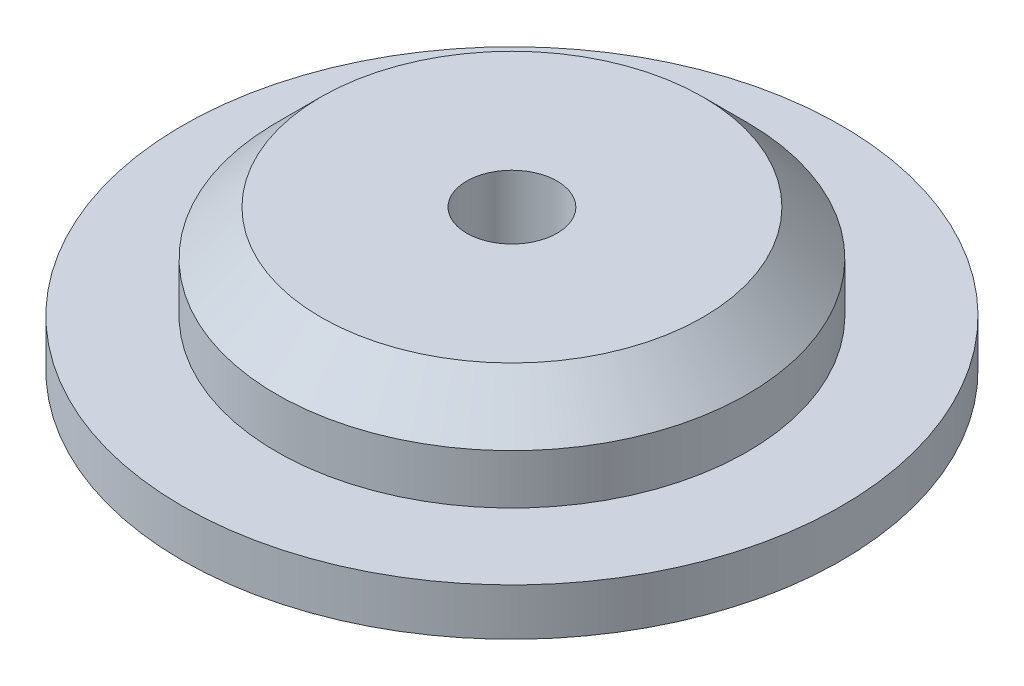
ISO-10303-21;
HEADER;
FILE_DESCRIPTION(('STEP AP214'),'2;1');
FILE_NAME('part.step','',(''),(''),'','','');
FILE_SCHEMA(('AUTOMOTIVE_DESIGN { 1 0 10303 214 1 1 1 1 }'));
ENDSEC;
DATA;
#1=APPLICATION_CONTEXT('core data for automotive mechanical design processes');
#2=APPLICATION_PROTOCOL_DEFINITION('international standard','automotive_design',2000,#1);
#3=PRODUCT_CONTEXT('',#1,'mechanical');
#4=PRODUCT('Part','Part','',(#3));
#5=PRODUCT_RELATED_PRODUCT_CATEGORY('part','',(#4));
#6=PRODUCT_DEFINITION_FORMATION('','',#4);
#7=PRODUCT_DEFINITION_CONTEXT('part definition',#1,'design');
#8=PRODUCT_DEFINITION('design','',#6,#7);
#9=PRODUCT_DEFINITION_SHAPE('','',#8);
#10=(LENGTH_UNIT() NAMED_UNIT(*) SI_UNIT(.MILLI.,.METRE.));
#11=(NAMED_UNIT(*) PLANE_ANGLE_UNIT() SI_UNIT($,.RADIAN.));
#12=(NAMED_UNIT(*) SI_UNIT($,.STERADIAN.) SOLID_ANGLE_UNIT());
#13=UNCERTAINTY_MEASURE_WITH_UNIT(LENGTH_MEASURE(1.E-05),#10,'distance_accuracy_value','');
#14=(GEOMETRIC_REPRESENTATION_CONTEXT(3) GLOBAL_UNCERTAINTY_ASSIGNED_CONTEXT((#13)) GLOBAL_UNIT_ASSIGNED_CONTEXT((#10,
#11,#12)) REPRESENTATION_CONTEXT('',''));
#15=CARTESIAN_POINT('',(0.,0.,0.));
#16=DIRECTION('',(0.,0.,1.));
#17=DIRECTION('',(1.,0.,0.));
#18=AXIS2_PLACEMENT_3D('',#15,#16,#17);
#19=CARTESIAN_POINT('',(0.,9.525,0.));
#20=DIRECTION('',(0.,-1.,0.));
#21=DIRECTION('',(0.,0.,-1.));
#22=AXIS2_PLACEMENT_3D('',#19,#20,#21);
#23=CYLINDRICAL_SURFACE('',#22,10.4);
#24=CARTESIAN_POINT('',(0.,0.,0.));
#25=DIRECTION('',(0.,1.,0.));
#26=DIRECTION('',(0.,0.,1.));
#27=AXIS2_PLACEMENT_3D('',#24,#25,#26);
#28=CIRCLE('',#27,10.4);
#29=CARTESIAN_POINT('',(0.,0.,-10.4));
#30=VERTEX_POINT('',#29);
#31=EDGE_CURVE('E53',#30,#30,#28,.T.);
#32=CARTESIAN_POINT('',(0.,3.175,0.));
#33=DIRECTION('',(0.,1.,0.));
#34=DIRECTION('',(0.,0.,1.));
#35=AXIS2_PLACEMENT_3D('',#32,#33,#34);
#36=CIRCLE('',#35,10.4);
#37=CARTESIAN_POINT('',(0.,3.175,-10.4));
#38=VERTEX_POINT('',#37);
#39=EDGE_CURVE('E59',#38,#38,#36,.T.);
#40=CARTESIAN_POINT('',(0.,0.,-10.4));
#41=CARTESIAN_POINT('',(0.,0.0330729166666665,-10.4));
#42=CARTESIAN_POINT('',(0.,0.066145833333333,-10.4));
#43=CARTESIAN_POINT('',(0.,0.132291666666667,-10.4));
#44=CARTESIAN_POINT('',(0.,0.165364583333334,-10.4));
#45=CARTESIAN_POINT('',(0.,0.231510416666667,-10.4));
#46=CARTESIAN_POINT('',(0.,0.264583333333334,-10.4));
#47=CARTESIAN_POINT('',(0.,0.330729166666667,-10.4));
#48=CARTESIAN_POINT('',(0.,0.363802083333333,-10.4));
#49=CARTESIAN_POINT('',(0.,0.429947916666667,-10.4));
#50=CARTESIAN_POINT('',(0.,0.463020833333334,-10.4));
#51=CARTESIAN_POINT('',(0.,0.529166666666667,-10.4));
#52=CARTESIAN_POINT('',(0.,0.562239583333334,-10.4));
#53=CARTESIAN_POINT('',(0.,0.628385416666667,-10.4));
#54=CARTESIAN_POINT('',(0.,0.661458333333333,-10.4));
#55=CARTESIAN_POINT('',(0.,0.727604166666666,-10.4));
#56=CARTESIAN_POINT('',(0.,0.760677083333333,-10.4));
#57=CARTESIAN_POINT('',(0.,0.826822916666666,-10.4));
#58=CARTESIAN_POINT('',(0.,0.859895833333334,-10.4));
#59=CARTESIAN_POINT('',(0.,0.926041666666667,-10.4));
#60=CARTESIAN_POINT('',(0.,0.959114583333334,-10.4));
#61=CARTESIAN_POINT('',(0.,1.02526041666667,-10.4));
#62=CARTESIAN_POINT('',(0.,1.05833333333333,-10.4));
#63=CARTESIAN_POINT('',(0.,1.12447916666667,-10.4));
#64=CARTESIAN_POINT('',(0.,1.15755208333333,-10.4));
#65=CARTESIAN_POINT('',(0.,1.22369791666667,-10.4));
#66=CARTESIAN_POINT('',(0.,1.25677083333333,-10.4));
#67=CARTESIAN_POINT('',(0.,1.32291666666667,-10.4));
#68=CARTESIAN_POINT('',(0.,1.35598958333333,-10.4));
#69=CARTESIAN_POINT('',(0.,1.42213541666667,-10.4));
#70=CARTESIAN_POINT('',(0.,1.45520833333333,-10.4));
#71=CARTESIAN_POINT('',(0.,1.52135416666667,-10.4));
#72=CARTESIAN_POINT('',(0.,1.55442708333333,-10.4));
#73=CARTESIAN_POINT('',(0.,1.62057291666667,-10.4));
#74=CARTESIAN_POINT('',(0.,1.65364583333333,-10.4));
#75=CARTESIAN_POINT('',(0.,1.71979166666667,-10.4));
#76=CARTESIAN_POINT('',(0.,1.75286458333333,-10.4));
#77=CARTESIAN_POINT('',(0.,1.81901041666667,-10.4));
#78=CARTESIAN_POINT('',(0.,1.85208333333333,-10.4));
#79=CARTESIAN_POINT('',(0.,1.91822916666667,-10.4));
#80=CARTESIAN_POINT('',(0.,1.95130208333333,-10.4));
#81=CARTESIAN_POINT('',(0.,2.01744791666667,-10.4));
#82=CARTESIAN_POINT('',(0.,2.05052083333333,-10.4));
#83=CARTESIAN_POINT('',(0.,2.11666666666667,-10.4));
#84=CARTESIAN_POINT('',(0.,2.14973958333333,-10.4));
#85=CARTESIAN_POINT('',(0.,2.21588541666667,-10.4));
#86=CARTESIAN_POINT('',(0.,2.24895833333333,-10.4));
#87=CARTESIAN_POINT('',(0.,2.31510416666667,-10.4));
#88=CARTESIAN_POINT('',(0.,2.34817708333333,-10.4));
#89=CARTESIAN_POINT('',(0.,2.41432291666667,-10.4));
#90=CARTESIAN_POINT('',(0.,2.44739583333333,-10.4));
#91=CARTESIAN_POINT('',(0.,2.51354166666667,-10.4));
#92=CARTESIAN_POINT('',(0.,2.54661458333333,-10.4));
#93=CARTESIAN_POINT('',(0.,2.61276041666667,-10.4));
#94=CARTESIAN_POINT('',(0.,2.64583333333333,-10.4));
#95=CARTESIAN_POINT('',(0.,2.71197916666667,-10.4));
#96=CARTESIAN_POINT('',(0.,2.74505208333333,-10.4));
#97=CARTESIAN_POINT('',(0.,2.81119791666667,-10.4));
#98=CARTESIAN_POINT('',(0.,2.84427083333333,-10.4));
#99=CARTESIAN_POINT('',(0.,2.91041666666667,-10.4));
#100=CARTESIAN_POINT('',(0.,2.94348958333333,-10.4));
#101=CARTESIAN_POINT('',(0.,3.00963541666667,-10.4));
#102=CARTESIAN_POINT('',(0.,3.04270833333333,-10.4));
#103=CARTESIAN_POINT('',(0.,3.10885416666667,-10.4));
#104=CARTESIAN_POINT('',(0.,3.14192708333333,-10.4));
#105=CARTESIAN_POINT('',(0.,3.175,-10.4));
#106=B_SPLINE_CURVE_WITH_KNOTS('',3,(#40,#41,#42,#43,#44,#45,#46,#47,#48,#49,#50,#51,#52,#53,
#54,#55,#56,#57,#58,#59,#60,#61,#62,#63,#64,#65,#66,#67,#68,#69,#70,#71,#72,#73,#74,#75,#76,#77,
#78,#79,#80,#81,#82,#83,#84,#85,#86,#87,#88,#89,#90,#91,#92,#93,#94,#95,#96,#97,#98,#99,#100,
#101,#102,#103,#104,#105),.UNSPECIFIED.,.F.,.F.,(4,2,2,2,2,2,2,2,2,2,2,2,2,2,2,2,2,2,2,2,2,2,2,
2,2,2,2,2,2,2,2,2,4),(0.,0.0992187499999995,0.198437500000001,0.29765625,0.396875,
0.496093750000001,0.5953125,0.69453125,0.793749999999999,0.892968750000001,0.9921875,1.09140625,
1.190625,1.28984375,1.3890625,1.48828125,1.5875,1.68671875,1.7859375,1.88515625,1.984375,
2.08359375,2.1828125,2.28203125,2.38125,2.48046875,2.5796875,2.67890625,2.778125,2.87734375,
2.9765625,3.07578125,3.175),.UNSPECIFIED.);
#107=EDGE_CURVE('BSEAM33',#30,#38,#106,.T.);
#108=ORIENTED_EDGE('',*,*,#31,.F.);
#109=ORIENTED_EDGE('',*,*,#39,.T.);
#110=ORIENTED_EDGE('',*,*,#107,.T.);
#111=ORIENTED_EDGE('',*,*,#107,.F.);
#112=EDGE_LOOP('',(#108,#110,#109,#111));
#113=FACE_BOUND('',#112,.T.);
#114=ADVANCED_FACE('F33',(#113),#23,.F.);
#115=CARTESIAN_POINT('',(0.,3.175,0.));
#116=DIRECTION('',(0.,-1.,0.));
#117=DIRECTION('',(0.,0.,-1.));
#118=AXIS2_PLACEMENT_3D('',#115,#116,#117);
#119=CYLINDRICAL_SURFACE('',#118,22.225);
#120=CARTESIAN_POINT('',(0.,3.175,0.));
#121=DIRECTION('',(0.,1.,0.));
#122=DIRECTION('',(0.,0.,1.));
#123=AXIS2_PLACEMENT_3D('',#120,#121,#122);
#124=CIRCLE('',#123,22.225);
#125=CARTESIAN_POINT('',(0.,3.175,22.225));
#126=VERTEX_POINT('',#125);
#127=EDGE_CURVE('E44',#126,#126,#124,.T.);
#128=ORIENTED_EDGE('',*,*,#127,.F.);
#129=EDGE_LOOP('',(#128));
#130=FACE_BOUND('',#129,.T.);
#131=CARTESIAN_POINT('',(0.,0.,0.));
#132=DIRECTION('',(0.,1.,0.));
#133=DIRECTION('',(0.,0.,1.));
#134=AXIS2_PLACEMENT_3D('',#131,#132,#133);
#135=CIRCLE('',#134,22.225);
#136=CARTESIAN_POINT('',(0.,0.,22.225));
#137=VERTEX_POINT('',#136);
#138=EDGE_CURVE('E51',#137,#137,#135,.T.);
#139=ORIENTED_EDGE('',*,*,#138,.T.);
#140=EDGE_LOOP('',(#139));
#141=FACE_BOUND('',#140,.T.);
#142=ADVANCED_FACE('F90',(#130,#141),#119,.T.);
#143=CARTESIAN_POINT('',(0.,3.175,0.));
#144=DIRECTION('',(0.,1.,0.));
#145=DIRECTION('',(0.,0.,1.));
#146=AXIS2_PLACEMENT_3D('',#143,#144,#145);
#147=PLANE('',#146);
#148=CARTESIAN_POINT('',(0.,3.175,0.));
#149=DIRECTION('',(0.,1.,0.));
#150=DIRECTION('',(0.,0.,1.));
#151=AXIS2_PLACEMENT_3D('',#148,#149,#150);
#152=CIRCLE('',#151,15.875);
#153=CARTESIAN_POINT('',(0.,3.175,-15.875));
#154=VERTEX_POINT('',#153);
#155=EDGE_CURVE('E48',#154,#154,#152,.T.);
#156=ORIENTED_EDGE('',*,*,#155,.F.);
#157=EDGE_LOOP('',(#156));
#158=FACE_BOUND('',#157,.T.);
#159=ORIENTED_EDGE('',*,*,#127,.T.);
#160=EDGE_LOOP('',(#159));
#161=FACE_BOUND('',#160,.T.);
#162=ADVANCED_FACE('F96',(#158,#161),#147,.T.);
#163=CARTESIAN_POINT('',(0.,0.,0.));
#164=DIRECTION('',(0.,1.,0.));
#165=DIRECTION('',(0.,0.,1.));
#166=AXIS2_PLACEMENT_3D('',#163,#164,#165);
#167=PLANE('',#166);
#168=ORIENTED_EDGE('',*,*,#138,.F.);
#169=EDGE_LOOP('',(#168));
#170=FACE_BOUND('',#169,.T.);
#171=ORIENTED_EDGE('',*,*,#31,.T.);
#172=EDGE_LOOP('',(#171));
#173=FACE_BOUND('',#172,.T.);
#174=ADVANCED_FACE('F87',(#170,#173),#167,.F.);
#175=CARTESIAN_POINT('',(0.,9.525,0.));
#176=DIRECTION('',(0.,-1.,0.));
#177=DIRECTION('',(0.,0.,-1.));
#178=AXIS2_PLACEMENT_3D('',#175,#176,#177);
#179=CYLINDRICAL_SURFACE('',#178,15.875);
#180=CARTESIAN_POINT('',(0.,6.52500000000002,0.));
#181=DIRECTION('',(0.,1.,0.));
#182=DIRECTION('',(0.,0.,1.));
#183=AXIS2_PLACEMENT_3D('',#180,#181,#182);
#184=CIRCLE('',#183,15.875);
#185=CARTESIAN_POINT('',(0.,6.52500000000002,-15.875));
#186=VERTEX_POINT('',#185);
#187=EDGE_CURVE('E10',#186,#186,#184,.F.);
#188=CARTESIAN_POINT('',(0.,6.52500000000002,-15.875));
#189=CARTESIAN_POINT('',(0.,6.49010416666669,-15.875));
#190=CARTESIAN_POINT('',(0.,6.45520833333336,-15.875));
#191=CARTESIAN_POINT('',(0.,6.38541666666669,-15.875));
#192=CARTESIAN_POINT('',(0.,6.35052083333335,-15.875));
#193=CARTESIAN_POINT('',(0.,6.28072916666669,-15.875));
#194=CARTESIAN_POINT('',(0.,6.24583333333335,-15.875));
#195=CARTESIAN_POINT('',(0.,6.17604166666669,-15.875));
#196=CARTESIAN_POINT('',(0.,6.14114583333335,-15.875));
#197=CARTESIAN_POINT('',(0.,6.07135416666669,-15.875));
#198=CARTESIAN_POINT('',(0.,6.03645833333335,-15.875));
#199=CARTESIAN_POINT('',(0.,5.96666666666668,-15.875));
#200=CARTESIAN_POINT('',(0.,5.93177083333335,-15.875));
#201=CARTESIAN_POINT('',(0.,5.86197916666668,-15.875));
#202=CARTESIAN_POINT('',(0.,5.82708333333335,-15.875));
#203=CARTESIAN_POINT('',(0.,5.75729166666668,-15.875));
#204=CARTESIAN_POINT('',(0.,5.72239583333335,-15.875));
#205=CARTESIAN_POINT('',(0.,5.65260416666668,-15.875));
#206=CARTESIAN_POINT('',(0.,5.61770833333335,-15.875));
#207=CARTESIAN_POINT('',(0.,5.54791666666668,-15.875));
#208=CARTESIAN_POINT('',(0.,5.51302083333335,-15.875));
#209=CARTESIAN_POINT('',(0.,5.44322916666668,-15.875));
#210=CARTESIAN_POINT('',(0.,5.40833333333335,-15.875));
#211=CARTESIAN_POINT('',(0.,5.33854166666668,-15.875));
#212=CARTESIAN_POINT('',(0.,5.30364583333335,-15.875));
#213=CARTESIAN_POINT('',(0.,5.23385416666668,-15.875));
#214=CARTESIAN_POINT('',(0.,5.19895833333335,-15.875));
#215=CARTESIAN_POINT('',(0.,5.12916666666668,-15.875));
#216=CARTESIAN_POINT('',(0.,5.09427083333335,-15.875));
#217=CARTESIAN_POINT('',(0.,5.02447916666668,-15.875));
#218=CARTESIAN_POINT('',(0.,4.98958333333335,-15.875));
#219=CARTESIAN_POINT('',(0.,4.91979166666668,-15.875));
#220=CARTESIAN_POINT('',(0.,4.88489583333335,-15.875));
#221=CARTESIAN_POINT('',(0.,4.81510416666668,-15.875));
#222=CARTESIAN_POINT('',(0.,4.78020833333334,-15.875));
#223=CARTESIAN_POINT('',(0.,4.71041666666668,-15.875));
#224=CARTESIAN_POINT('',(0.,4.67552083333334,-15.875));
#225=CARTESIAN_POINT('',(0.,4.60572916666668,-15.875));
#226=CARTESIAN_POINT('',(0.,4.57083333333334,-15.875));
#227=CARTESIAN_POINT('',(0.,4.50104166666667,-15.875));
#228=CARTESIAN_POINT('',(0.,4.46614583333334,-15.875));
#229=CARTESIAN_POINT('',(0.,4.39635416666667,-15.875));
#230=CARTESIAN_POINT('',(0.,4.36145833333334,-15.875));
#231=CARTESIAN_POINT('',(0.,4.29166666666667,-15.875));
#232=CARTESIAN_POINT('',(0.,4.25677083333334,-15.875));
#233=CARTESIAN_POINT('',(0.,4.18697916666667,-15.875));
#234=CARTESIAN_POINT('',(0.,4.15208333333334,-15.875));
#235=CARTESIAN_POINT('',(0.,4.08229166666667,-15.875));
#236=CARTESIAN_POINT('',(0.,4.04739583333334,-15.875));
#237=CARTESIAN_POINT('',(0.,3.97760416666667,-15.875));
#238=CARTESIAN_POINT('',(0.,3.94270833333334,-15.875));
#239=CARTESIAN_POINT('',(0.,3.87291666666667,-15.875));
#240=CARTESIAN_POINT('',(0.,3.83802083333334,-15.875));
#241=CARTESIAN_POINT('',(0.,3.76822916666667,-15.875));
#242=CARTESIAN_POINT('',(0.,3.73333333333334,-15.875));
#243=CARTESIAN_POINT('',(0.,3.66354166666667,-15.875));
#244=CARTESIAN_POINT('',(0.,3.62864583333334,-15.875));
#245=CARTESIAN_POINT('',(0.,3.55885416666667,-15.875));
#246=CARTESIAN_POINT('',(0.,3.52395833333334,-15.875));
#247=CARTESIAN_POINT('',(0.,3.45416666666667,-15.875));
#248=CARTESIAN_POINT('',(0.,3.41927083333333,-15.875));
#249=CARTESIAN_POINT('',(0.,3.34947916666667,-15.875));
#250=CARTESIAN_POINT('',(0.,3.31458333333333,-15.875));
#251=CARTESIAN_POINT('',(0.,3.24479166666667,-15.875));
#252=CARTESIAN_POINT('',(0.,3.20989583333333,-15.875));
#253=CARTESIAN_POINT('',(0.,3.175,-15.875));
#254=B_SPLINE_CURVE_WITH_KNOTS('',3,(#188,#189,#190,#191,#192,#193,#194,#195,#196,#197,#198,
#199,#200,#201,#202,#203,#204,#205,#206,#207,#208,#209,#210,#211,#212,#213,#214,#215,#216,#217,
#218,#219,#220,#221,#222,#223,#224,#225,#226,#227,#228,#229,#230,#231,#232,#233,#234,#235,#236,
#237,#238,#239,#240,#241,#242,#243,#244,#245,#246,#247,#248,#249,#250,#251,#252,#253),
.UNSPECIFIED.,.F.,.F.,(4,2,2,2,2,2,2,2,2,2,2,2,2,2,2,2,2,2,2,2,2,2,2,2,2,2,2,2,2,2,2,2,4),(0.,
0.104687500000001,0.209375000000001,0.314062500000002,0.418750000000003,0.523437500000004,
0.628125000000005,0.732812500000005,0.837500000000007,0.942187500000006,1.04687500000001,
1.15156250000001,1.25625000000001,1.36093750000001,1.46562500000001,1.57031250000001,
1.67500000000001,1.77968750000001,1.88437500000001,1.98906250000001,2.09375000000001,
2.19843750000001,2.30312500000002,2.40781250000002,2.51250000000002,2.61718750000002,
2.72187500000002,2.82656250000002,2.93125000000002,3.03593750000002,3.14062500000002,
3.24531250000002,3.35000000000002),.UNSPECIFIED.);
#255=EDGE_CURVE('BSEAM80',#186,#154,#254,.T.);
#256=ORIENTED_EDGE('',*,*,#187,.T.);
#257=ORIENTED_EDGE('',*,*,#155,.T.);
#258=ORIENTED_EDGE('',*,*,#255,.T.);
#259=ORIENTED_EDGE('',*,*,#255,.F.);
#260=EDGE_LOOP('',(#256,#258,#257,#259));
#261=FACE_BOUND('',#260,.T.);
#262=ADVANCED_FACE('F80',(#261),#179,.T.);
#263=CARTESIAN_POINT('',(0.,9.525,0.));
#264=DIRECTION('',(0.,1.,0.));
#265=DIRECTION('',(0.,0.,1.));
#266=AXIS2_PLACEMENT_3D('',#263,#264,#265);
#267=PLANE('',#266);
#268=CARTESIAN_POINT('',(0.,9.525,0.));
#269=DIRECTION('',(0.,1.,0.));
#270=DIRECTION('',(0.,0.,1.));
#271=AXIS2_PLACEMENT_3D('',#268,#269,#270);
#272=CIRCLE('',#271,12.875);
#273=CARTESIAN_POINT('',(0.,9.525,12.875));
#274=VERTEX_POINT('',#273);
#275=EDGE_CURVE('E40',#274,#274,#272,.T.);
#276=ORIENTED_EDGE('',*,*,#275,.T.);
#277=EDGE_LOOP('',(#276));
#278=FACE_BOUND('',#277,.T.);
#279=CARTESIAN_POINT('',(0.,9.525,0.));
#280=DIRECTION('',(0.,1.,0.));
#281=DIRECTION('',(0.,0.,1.));
#282=AXIS2_PLACEMENT_3D('',#279,#280,#281);
#283=CIRCLE('',#282,3.05);
#284=CARTESIAN_POINT('',(0.,9.525,3.05));
#285=VERTEX_POINT('',#284);
#286=EDGE_CURVE('E63',#285,#285,#283,.T.);
#287=ORIENTED_EDGE('',*,*,#286,.F.);
#288=EDGE_LOOP('',(#287));
#289=FACE_BOUND('',#288,.T.);
#290=ADVANCED_FACE('F78',(#278,#289),#267,.T.);
#291=CARTESIAN_POINT('',(0.,3.175,0.));
#292=DIRECTION('',(0.,1.,0.));
#293=DIRECTION('',(0.,0.,1.));
#294=AXIS2_PLACEMENT_3D('',#291,#292,#293);
#295=PLANE('',#294);
#296=CARTESIAN_POINT('',(0.,3.175,0.));
#297=DIRECTION('',(0.,1.,0.));
#298=DIRECTION('',(0.,0.,1.));
#299=AXIS2_PLACEMENT_3D('',#296,#297,#298);
#300=CIRCLE('',#299,3.05);
#301=CARTESIAN_POINT('',(0.,3.175,3.05));
#302=VERTEX_POINT('',#301);
#303=EDGE_CURVE('E62',#302,#302,#300,.T.);
#304=ORIENTED_EDGE('',*,*,#303,.T.);
#305=EDGE_LOOP('',(#304));
#306=FACE_BOUND('',#305,.T.);
#307=ORIENTED_EDGE('',*,*,#39,.F.);
#308=EDGE_LOOP('',(#307));
#309=FACE_BOUND('',#308,.T.);
#310=ADVANCED_FACE('F69',(#306,#309),#295,.F.);
#311=CARTESIAN_POINT('',(0.,3.175,0.));
#312=DIRECTION('',(0.,1.,0.));
#313=DIRECTION('',(0.,0.,1.));
#314=AXIS2_PLACEMENT_3D('',#311,#312,#313);
#315=CYLINDRICAL_SURFACE('',#314,3.05);
#316=ORIENTED_EDGE('',*,*,#303,.F.);
#317=EDGE_LOOP('',(#316));
#318=FACE_BOUND('',#317,.T.);
#319=ORIENTED_EDGE('',*,*,#286,.T.);
#320=EDGE_LOOP('',(#319));
#321=FACE_BOUND('',#320,.T.);
#322=ADVANCED_FACE('F72',(#318,#321),#315,.F.);
#323=CARTESIAN_POINT('',(0.,9.525,0.));
#324=DIRECTION('',(0.,-1.,0.));
#325=DIRECTION('',(0.,0.,-1.));
#326=AXIS2_PLACEMENT_3D('',#323,#324,#325);
#327=CONICAL_SURFACE('',#326,12.875,0.785398163397446);
#328=ORIENTED_EDGE('',*,*,#187,.F.);
#329=EDGE_LOOP('',(#328));
#330=FACE_BOUND('',#329,.T.);
#331=ORIENTED_EDGE('',*,*,#275,.F.);
#332=EDGE_LOOP('',(#331));
#333=FACE_BOUND('',#332,.T.);
#334=ADVANCED_FACE('F35',(#330,#333),#327,.T.);
#335=CLOSED_SHELL('',(#114,#142,#162,#174,#262,#290,#310,#322,#334));
#336=MANIFOLD_SOLID_BREP('B2',#335);
#337=ADVANCED_BREP_SHAPE_REPRESENTATION('',(#18,#336),#14);
#338=SHAPE_DEFINITION_REPRESENTATION(#9,#337);
ENDSEC;
END-ISO-10303-21;
